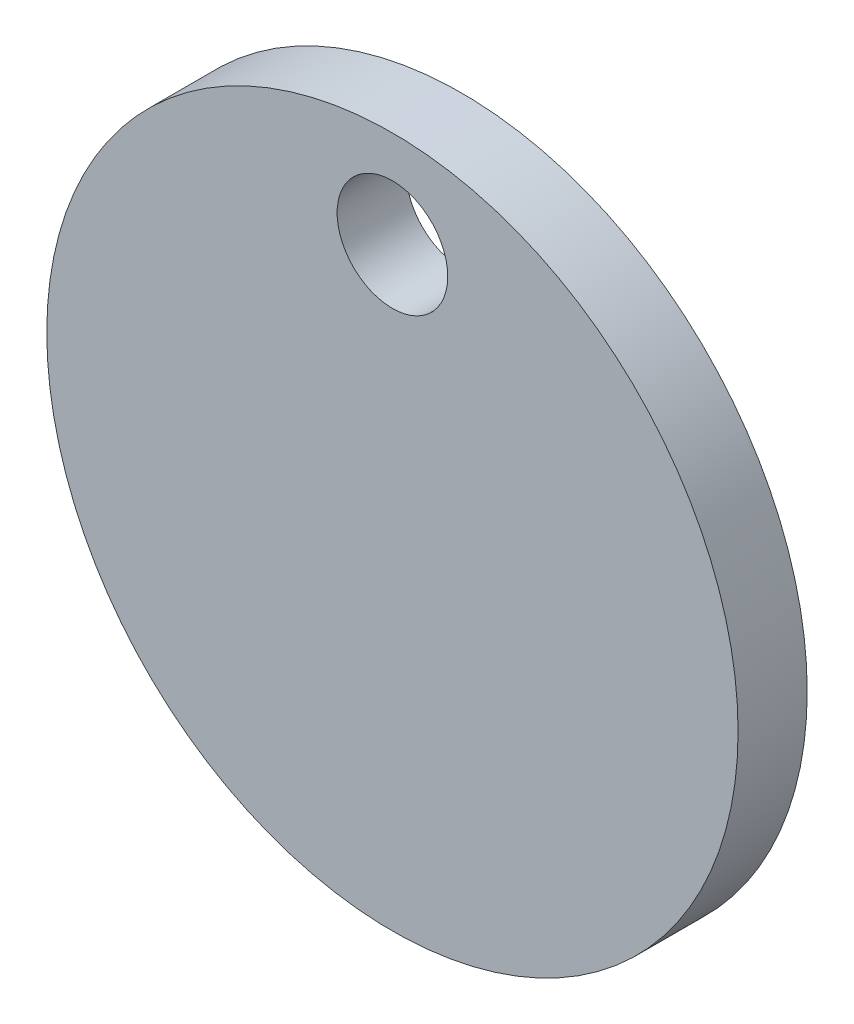
ISO-10303-21;
HEADER;
FILE_DESCRIPTION(('STEP AP214'),'2;1');
FILE_NAME('part.step','',(''),(''),'','','');
FILE_SCHEMA(('AUTOMOTIVE_DESIGN { 1 0 10303 214 1 1 1 1 }'));
ENDSEC;
DATA;
#1=APPLICATION_CONTEXT('core data for automotive mechanical design processes');
#2=APPLICATION_PROTOCOL_DEFINITION('international standard','automotive_design',2000,#1);
#3=PRODUCT_CONTEXT('',#1,'mechanical');
#4=PRODUCT('Part','Part','',(#3));
#5=PRODUCT_RELATED_PRODUCT_CATEGORY('part','',(#4));
#6=PRODUCT_DEFINITION_FORMATION('','',#4);
#7=PRODUCT_DEFINITION_CONTEXT('part definition',#1,'design');
#8=PRODUCT_DEFINITION('design','',#6,#7);
#9=PRODUCT_DEFINITION_SHAPE('','',#8);
#10=(LENGTH_UNIT() NAMED_UNIT(*) SI_UNIT(.MILLI.,.METRE.));
#11=(NAMED_UNIT(*) PLANE_ANGLE_UNIT() SI_UNIT($,.RADIAN.));
#12=(NAMED_UNIT(*) SI_UNIT($,.STERADIAN.) SOLID_ANGLE_UNIT());
#13=UNCERTAINTY_MEASURE_WITH_UNIT(LENGTH_MEASURE(1.E-05),#10,'distance_accuracy_value','');
#14=(GEOMETRIC_REPRESENTATION_CONTEXT(3) GLOBAL_UNCERTAINTY_ASSIGNED_CONTEXT((#13)) GLOBAL_UNIT_ASSIGNED_CONTEXT((#10,
#11,#12)) REPRESENTATION_CONTEXT('',''));
#15=CARTESIAN_POINT('',(0.,0.,0.));
#16=DIRECTION('',(0.,0.,1.));
#17=DIRECTION('',(1.,0.,0.));
#18=AXIS2_PLACEMENT_3D('',#15,#16,#17);
#19=CARTESIAN_POINT('',(0.,0.,10.));
#20=DIRECTION('',(0.,0.,-1.));
#21=DIRECTION('',(-1.,0.,0.));
#22=AXIS2_PLACEMENT_3D('',#19,#20,#21);
#23=CYLINDRICAL_SURFACE('',#22,50.);
#24=CARTESIAN_POINT('',(0.,0.,10.));
#25=DIRECTION('',(0.,0.,1.));
#26=DIRECTION('',(1.,0.,0.));
#27=AXIS2_PLACEMENT_3D('',#24,#25,#26);
#28=CIRCLE('',#27,50.);
#29=CARTESIAN_POINT('',(50.,0.,10.));
#30=VERTEX_POINT('',#29);
#31=EDGE_CURVE('E10',#30,#30,#28,.T.);
#32=ORIENTED_EDGE('',*,*,#31,.F.);
#33=EDGE_LOOP('',(#32));
#34=FACE_BOUND('',#33,.T.);
#35=CARTESIAN_POINT('',(0.,0.,0.));
#36=DIRECTION('',(0.,0.,1.));
#37=DIRECTION('',(1.,0.,0.));
#38=AXIS2_PLACEMENT_3D('',#35,#36,#37);
#39=CIRCLE('',#38,50.);
#40=CARTESIAN_POINT('',(50.,0.,0.));
#41=VERTEX_POINT('',#40);
#42=EDGE_CURVE('E34',#41,#41,#39,.T.);
#43=ORIENTED_EDGE('',*,*,#42,.T.);
#44=EDGE_LOOP('',(#43));
#45=FACE_BOUND('',#44,.T.);
#46=ADVANCED_FACE('F31',(#34,#45),#23,.T.);
#47=CARTESIAN_POINT('',(0.,0.,10.));
#48=DIRECTION('',(0.,0.,1.));
#49=DIRECTION('',(1.,0.,0.));
#50=AXIS2_PLACEMENT_3D('',#47,#48,#49);
#51=PLANE('',#50);
#52=CARTESIAN_POINT('',(0.,36.,10.));
#53=DIRECTION('',(0.,0.,1.));
#54=DIRECTION('',(1.,0.,0.));
#55=AXIS2_PLACEMENT_3D('',#52,#53,#54);
#56=CIRCLE('',#55,8.);
#57=CARTESIAN_POINT('',(8.,36.,10.));
#58=VERTEX_POINT('',#57);
#59=EDGE_CURVE('E43',#58,#58,#56,.T.);
#60=ORIENTED_EDGE('',*,*,#59,.F.);
#61=EDGE_LOOP('',(#60));
#62=FACE_BOUND('',#61,.T.);
#63=ORIENTED_EDGE('',*,*,#31,.T.);
#64=EDGE_LOOP('',(#63));
#65=FACE_BOUND('',#64,.T.);
#66=ADVANCED_FACE('F58',(#62,#65),#51,.T.);
#67=CARTESIAN_POINT('',(0.,0.,0.));
#68=DIRECTION('',(0.,0.,1.));
#69=DIRECTION('',(1.,0.,0.));
#70=AXIS2_PLACEMENT_3D('',#67,#68,#69);
#71=PLANE('',#70);
#72=CARTESIAN_POINT('',(0.,36.,0.));
#73=DIRECTION('',(0.,0.,1.));
#74=DIRECTION('',(1.,0.,0.));
#75=AXIS2_PLACEMENT_3D('',#72,#73,#74);
#76=CIRCLE('',#75,8.);
#77=CARTESIAN_POINT('',(8.,36.,0.));
#78=VERTEX_POINT('',#77);
#79=EDGE_CURVE('E41',#78,#78,#76,.T.);
#80=ORIENTED_EDGE('',*,*,#79,.T.);
#81=EDGE_LOOP('',(#80));
#82=FACE_BOUND('',#81,.T.);
#83=ORIENTED_EDGE('',*,*,#42,.F.);
#84=EDGE_LOOP('',(#83));
#85=FACE_BOUND('',#84,.T.);
#86=ADVANCED_FACE('F49',(#82,#85),#71,.F.);
#87=CARTESIAN_POINT('',(0.,36.,0.));
#88=DIRECTION('',(0.,0.,1.));
#89=DIRECTION('',(1.,0.,0.));
#90=AXIS2_PLACEMENT_3D('',#87,#88,#89);
#91=CYLINDRICAL_SURFACE('',#90,8.);
#92=ORIENTED_EDGE('',*,*,#79,.F.);
#93=EDGE_LOOP('',(#92));
#94=FACE_BOUND('',#93,.T.);
#95=ORIENTED_EDGE('',*,*,#59,.T.);
#96=EDGE_LOOP('',(#95));
#97=FACE_BOUND('',#96,.T.);
#98=ADVANCED_FACE('F52',(#94,#97),#91,.F.);
#99=CLOSED_SHELL('',(#46,#66,#86,#98));
#100=MANIFOLD_SOLID_BREP('B2',#99);
#101=ADVANCED_BREP_SHAPE_REPRESENTATION('',(#18,#100),#14);
#102=SHAPE_DEFINITION_REPRESENTATION(#9,#101);
ENDSEC;
END-ISO-10303-21;
